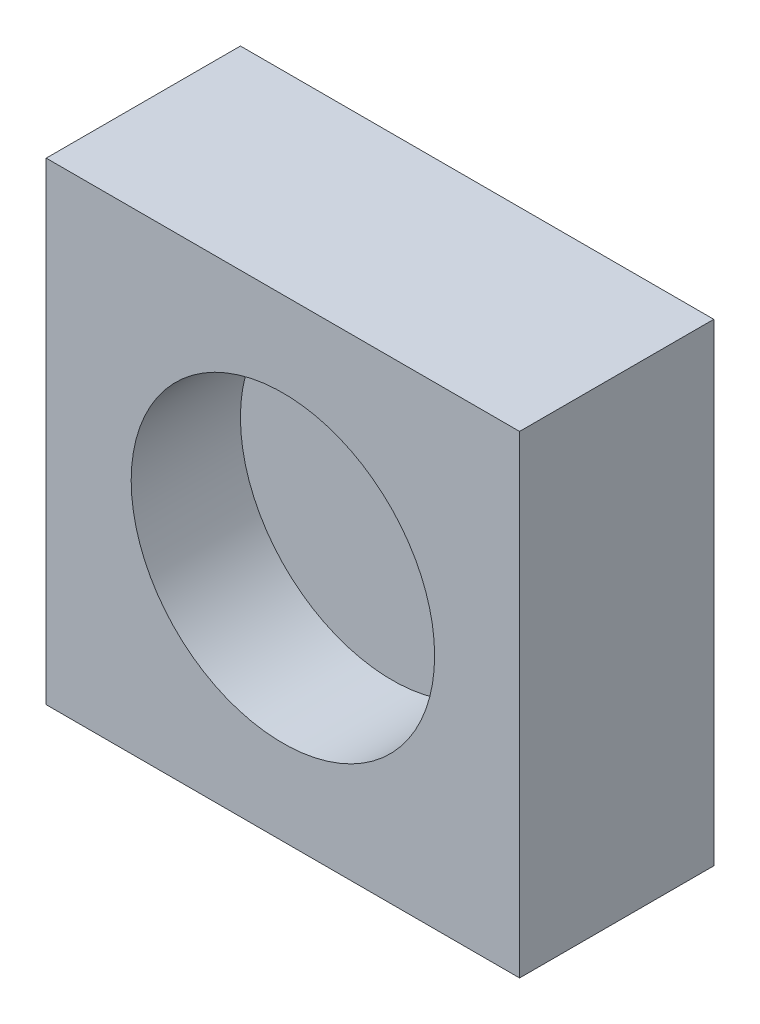
ISO-10303-21;
HEADER;
FILE_DESCRIPTION(('STEP AP214'),'2;1');
FILE_NAME('part.step','',(''),(''),'','','');
FILE_SCHEMA(('AUTOMOTIVE_DESIGN { 1 0 10303 214 1 1 1 1 }'));
ENDSEC;
DATA;
#1=APPLICATION_CONTEXT('core data for automotive mechanical design processes');
#2=APPLICATION_PROTOCOL_DEFINITION('international standard','automotive_design',2000,#1);
#3=PRODUCT_CONTEXT('',#1,'mechanical');
#4=PRODUCT('Part','Part','',(#3));
#5=PRODUCT_RELATED_PRODUCT_CATEGORY('part','',(#4));
#6=PRODUCT_DEFINITION_FORMATION('','',#4);
#7=PRODUCT_DEFINITION_CONTEXT('part definition',#1,'design');
#8=PRODUCT_DEFINITION('design','',#6,#7);
#9=PRODUCT_DEFINITION_SHAPE('','',#8);
#10=(LENGTH_UNIT() NAMED_UNIT(*) SI_UNIT(.MILLI.,.METRE.));
#11=(NAMED_UNIT(*) PLANE_ANGLE_UNIT() SI_UNIT($,.RADIAN.));
#12=(NAMED_UNIT(*) SI_UNIT($,.STERADIAN.) SOLID_ANGLE_UNIT());
#13=UNCERTAINTY_MEASURE_WITH_UNIT(LENGTH_MEASURE(1.E-05),#10,'distance_accuracy_value','');
#14=(GEOMETRIC_REPRESENTATION_CONTEXT(3) GLOBAL_UNCERTAINTY_ASSIGNED_CONTEXT((#13)) GLOBAL_UNIT_ASSIGNED_CONTEXT((#10,
#11,#12)) REPRESENTATION_CONTEXT('',''));
#15=CARTESIAN_POINT('',(0.,0.,0.));
#16=DIRECTION('',(0.,0.,1.));
#17=DIRECTION('',(1.,0.,0.));
#18=AXIS2_PLACEMENT_3D('',#15,#16,#17);
#19=CARTESIAN_POINT('',(-3.9,3.9,3.2));
#20=DIRECTION('',(1.,0.,0.));
#21=DIRECTION('',(0.,1.,0.));
#22=AXIS2_PLACEMENT_3D('',#19,#20,#21);
#23=PLANE('',#22);
#24=DIRECTION('',(0.,-1.,0.));
#25=VECTOR('',#24,1.);
#26=CARTESIAN_POINT('',(-3.9,3.9,0.));
#27=LINE('',#26,#25);
#28=CARTESIAN_POINT('',(-3.9,3.9,0.));
#29=VERTEX_POINT('',#28);
#30=CARTESIAN_POINT('',(-3.9,-3.9,0.));
#31=VERTEX_POINT('',#30);
#32=EDGE_CURVE('E98',#29,#31,#27,.T.);
#33=ORIENTED_EDGE('',*,*,#32,.T.);
#34=DIRECTION('',(0.,0.,-1.));
#35=VECTOR('',#34,1.);
#36=CARTESIAN_POINT('',(-3.9,-3.9,3.2));
#37=LINE('',#36,#35);
#38=CARTESIAN_POINT('',(-3.9,-3.9,3.2));
#39=VERTEX_POINT('',#38);
#40=EDGE_CURVE('E11',#39,#31,#37,.T.);
#41=ORIENTED_EDGE('',*,*,#40,.F.);
#42=DIRECTION('',(0.,-1.,0.));
#43=VECTOR('',#42,1.);
#44=CARTESIAN_POINT('',(-3.9,3.9,3.2));
#45=LINE('',#44,#43);
#46=CARTESIAN_POINT('',(-3.9,3.9,3.2));
#47=VERTEX_POINT('',#46);
#48=EDGE_CURVE('E86',#47,#39,#45,.T.);
#49=ORIENTED_EDGE('',*,*,#48,.F.);
#50=DIRECTION('',(0.,0.,-1.));
#51=VECTOR('',#50,1.);
#52=CARTESIAN_POINT('',(-3.9,3.9,3.2));
#53=LINE('',#52,#51);
#54=EDGE_CURVE('E94',#47,#29,#53,.T.);
#55=ORIENTED_EDGE('',*,*,#54,.T.);
#56=EDGE_LOOP('',(#33,#41,#49,#55));
#57=FACE_BOUND('',#56,.T.);
#58=ADVANCED_FACE('F35',(#57),#23,.F.);
#59=CARTESIAN_POINT('',(3.9,-3.9,3.2));
#60=DIRECTION('',(0.,1.,0.));
#61=DIRECTION('',(-1.,0.,0.));
#62=AXIS2_PLACEMENT_3D('',#59,#60,#61);
#63=PLANE('',#62);
#64=DIRECTION('',(1.,0.,0.));
#65=VECTOR('',#64,1.);
#66=CARTESIAN_POINT('',(3.9,-3.9,0.));
#67=LINE('',#66,#65);
#68=CARTESIAN_POINT('',(3.9,-3.9,0.));
#69=VERTEX_POINT('',#68);
#70=EDGE_CURVE('E90',#31,#69,#67,.T.);
#71=ORIENTED_EDGE('',*,*,#70,.T.);
#72=DIRECTION('',(0.,0.,-1.));
#73=VECTOR('',#72,1.);
#74=CARTESIAN_POINT('',(3.9,-3.9,3.2));
#75=LINE('',#74,#73);
#76=CARTESIAN_POINT('',(3.9,-3.9,3.2));
#77=VERTEX_POINT('',#76);
#78=EDGE_CURVE('E43',#77,#69,#75,.T.);
#79=ORIENTED_EDGE('',*,*,#78,.F.);
#80=DIRECTION('',(1.,0.,0.));
#81=VECTOR('',#80,1.);
#82=CARTESIAN_POINT('',(3.9,-3.9,3.2));
#83=LINE('',#82,#81);
#84=EDGE_CURVE('E81',#39,#77,#83,.T.);
#85=ORIENTED_EDGE('',*,*,#84,.F.);
#86=ORIENTED_EDGE('',*,*,#40,.T.);
#87=EDGE_LOOP('',(#71,#79,#85,#86));
#88=FACE_BOUND('',#87,.T.);
#89=ADVANCED_FACE('F89',(#88),#63,.F.);
#90=CARTESIAN_POINT('',(3.9,3.9,3.2));
#91=DIRECTION('',(-1.,0.,0.));
#92=DIRECTION('',(0.,-1.,0.));
#93=AXIS2_PLACEMENT_3D('',#90,#91,#92);
#94=PLANE('',#93);
#95=DIRECTION('',(0.,1.,0.));
#96=VECTOR('',#95,1.);
#97=CARTESIAN_POINT('',(3.9,3.9,0.));
#98=LINE('',#97,#96);
#99=CARTESIAN_POINT('',(3.9,3.9,0.));
#100=VERTEX_POINT('',#99);
#101=EDGE_CURVE('E68',#69,#100,#98,.T.);
#102=ORIENTED_EDGE('',*,*,#101,.T.);
#103=DIRECTION('',(0.,0.,-1.));
#104=VECTOR('',#103,1.);
#105=CARTESIAN_POINT('',(3.9,3.9,3.2));
#106=LINE('',#105,#104);
#107=CARTESIAN_POINT('',(3.9,3.9,3.2));
#108=VERTEX_POINT('',#107);
#109=EDGE_CURVE('E91',#108,#100,#106,.T.);
#110=ORIENTED_EDGE('',*,*,#109,.F.);
#111=DIRECTION('',(0.,1.,0.));
#112=VECTOR('',#111,1.);
#113=CARTESIAN_POINT('',(3.9,3.9,3.2));
#114=LINE('',#113,#112);
#115=EDGE_CURVE('E84',#77,#108,#114,.T.);
#116=ORIENTED_EDGE('',*,*,#115,.F.);
#117=ORIENTED_EDGE('',*,*,#78,.T.);
#118=EDGE_LOOP('',(#102,#110,#116,#117));
#119=FACE_BOUND('',#118,.T.);
#120=ADVANCED_FACE('F92',(#119),#94,.F.);
#121=CARTESIAN_POINT('',(3.9,3.9,3.2));
#122=DIRECTION('',(0.,-1.,0.));
#123=DIRECTION('',(1.,0.,0.));
#124=AXIS2_PLACEMENT_3D('',#121,#122,#123);
#125=PLANE('',#124);
#126=DIRECTION('',(-1.,0.,0.));
#127=VECTOR('',#126,1.);
#128=CARTESIAN_POINT('',(3.9,3.9,0.));
#129=LINE('',#128,#127);
#130=EDGE_CURVE('E74',#100,#29,#129,.T.);
#131=ORIENTED_EDGE('',*,*,#130,.T.);
#132=ORIENTED_EDGE('',*,*,#54,.F.);
#133=DIRECTION('',(-1.,0.,0.));
#134=VECTOR('',#133,1.);
#135=CARTESIAN_POINT('',(3.9,3.9,3.2));
#136=LINE('',#135,#134);
#137=EDGE_CURVE('E51',#108,#47,#136,.T.);
#138=ORIENTED_EDGE('',*,*,#137,.F.);
#139=ORIENTED_EDGE('',*,*,#109,.T.);
#140=EDGE_LOOP('',(#131,#132,#138,#139));
#141=FACE_BOUND('',#140,.T.);
#142=ADVANCED_FACE('F106',(#141),#125,.F.);
#143=CARTESIAN_POINT('',(0.,0.,3.2));
#144=DIRECTION('',(0.,0.,-1.));
#145=DIRECTION('',(-1.,0.,0.));
#146=AXIS2_PLACEMENT_3D('',#143,#144,#145);
#147=PLANE('',#146);
#148=CARTESIAN_POINT('',(0.,0.,3.2));
#149=DIRECTION('',(0.,0.,1.));
#150=DIRECTION('',(1.,0.,0.));
#151=AXIS2_PLACEMENT_3D('',#148,#149,#150);
#152=CIRCLE('',#151,2.5);
#153=CARTESIAN_POINT('',(2.5,0.,3.2));
#154=VERTEX_POINT('',#153);
#155=EDGE_CURVE('E112',#154,#154,#152,.T.);
#156=ORIENTED_EDGE('',*,*,#155,.F.);
#157=EDGE_LOOP('',(#156));
#158=FACE_BOUND('',#157,.T.);
#159=ORIENTED_EDGE('',*,*,#48,.T.);
#160=ORIENTED_EDGE('',*,*,#84,.T.);
#161=ORIENTED_EDGE('',*,*,#115,.T.);
#162=ORIENTED_EDGE('',*,*,#137,.T.);
#163=EDGE_LOOP('',(#159,#160,#161,#162));
#164=FACE_BOUND('',#163,.T.);
#165=ADVANCED_FACE('F82',(#158,#164),#147,.F.);
#166=CARTESIAN_POINT('',(0.,0.,0.));
#167=DIRECTION('',(0.,0.,-1.));
#168=DIRECTION('',(-1.,0.,0.));
#169=AXIS2_PLACEMENT_3D('',#166,#167,#168);
#170=PLANE('',#169);
#171=ORIENTED_EDGE('',*,*,#32,.F.);
#172=ORIENTED_EDGE('',*,*,#130,.F.);
#173=ORIENTED_EDGE('',*,*,#101,.F.);
#174=ORIENTED_EDGE('',*,*,#70,.F.);
#175=EDGE_LOOP('',(#171,#172,#173,#174));
#176=FACE_BOUND('',#175,.T.);
#177=ADVANCED_FACE('F109',(#176),#170,.T.);
#178=CARTESIAN_POINT('',(0.,0.,1.4));
#179=DIRECTION('',(0.,0.,1.));
#180=DIRECTION('',(1.,0.,0.));
#181=AXIS2_PLACEMENT_3D('',#178,#179,#180);
#182=CYLINDRICAL_SURFACE('',#181,2.5);
#183=CARTESIAN_POINT('',(0.,0.,1.4));
#184=DIRECTION('',(0.,0.,1.));
#185=DIRECTION('',(1.,0.,0.));
#186=AXIS2_PLACEMENT_3D('',#183,#184,#185);
#187=CIRCLE('',#186,2.5);
#188=CARTESIAN_POINT('',(2.5,0.,1.4));
#189=VERTEX_POINT('',#188);
#190=EDGE_CURVE('E101',#189,#189,#187,.T.);
#191=ORIENTED_EDGE('',*,*,#190,.F.);
#192=EDGE_LOOP('',(#191));
#193=FACE_BOUND('',#192,.T.);
#194=ORIENTED_EDGE('',*,*,#155,.T.);
#195=EDGE_LOOP('',(#194));
#196=FACE_BOUND('',#195,.T.);
#197=ADVANCED_FACE('F120',(#193,#196),#182,.F.);
#198=CARTESIAN_POINT('',(0.,0.,1.4));
#199=DIRECTION('',(0.,0.,1.));
#200=DIRECTION('',(1.,0.,0.));
#201=AXIS2_PLACEMENT_3D('',#198,#199,#200);
#202=PLANE('',#201);
#203=ORIENTED_EDGE('',*,*,#190,.T.);
#204=EDGE_LOOP('',(#203));
#205=FACE_BOUND('',#204,.T.);
#206=ADVANCED_FACE('F118',(#205),#202,.T.);
#207=CLOSED_SHELL('',(#58,#89,#120,#142,#165,#177,#197,#206));
#208=MANIFOLD_SOLID_BREP('B2',#207);
#209=ADVANCED_BREP_SHAPE_REPRESENTATION('',(#18,#208),#14);
#210=SHAPE_DEFINITION_REPRESENTATION(#9,#209);
ENDSEC;
END-ISO-10303-21;
